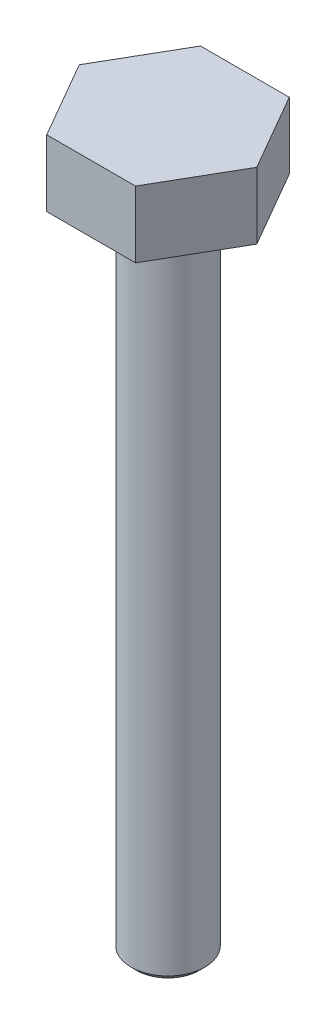
ISO-10303-21;
HEADER;
FILE_DESCRIPTION(('STEP AP214'),'2;1');
FILE_NAME('part.step','',(''),(''),'','','');
FILE_SCHEMA(('AUTOMOTIVE_DESIGN { 1 0 10303 214 1 1 1 1 }'));
ENDSEC;
DATA;
#1=APPLICATION_CONTEXT('core data for automotive mechanical design processes');
#2=APPLICATION_PROTOCOL_DEFINITION('international standard','automotive_design',2000,#1);
#3=PRODUCT_CONTEXT('',#1,'mechanical');
#4=PRODUCT('Part','Part','',(#3));
#5=PRODUCT_RELATED_PRODUCT_CATEGORY('part','',(#4));
#6=PRODUCT_DEFINITION_FORMATION('','',#4);
#7=PRODUCT_DEFINITION_CONTEXT('part definition',#1,'design');
#8=PRODUCT_DEFINITION('design','',#6,#7);
#9=PRODUCT_DEFINITION_SHAPE('','',#8);
#10=(LENGTH_UNIT() NAMED_UNIT(*) SI_UNIT(.MILLI.,.METRE.));
#11=(NAMED_UNIT(*) PLANE_ANGLE_UNIT() SI_UNIT($,.RADIAN.));
#12=(NAMED_UNIT(*) SI_UNIT($,.STERADIAN.) SOLID_ANGLE_UNIT());
#13=UNCERTAINTY_MEASURE_WITH_UNIT(LENGTH_MEASURE(1.E-05),#10,'distance_accuracy_value','');
#14=(GEOMETRIC_REPRESENTATION_CONTEXT(3) GLOBAL_UNCERTAINTY_ASSIGNED_CONTEXT((#13)) GLOBAL_UNIT_ASSIGNED_CONTEXT((#10,
#11,#12)) REPRESENTATION_CONTEXT('',''));
#15=CARTESIAN_POINT('',(0.,0.,0.));
#16=DIRECTION('',(0.,0.,1.));
#17=DIRECTION('',(1.,0.,0.));
#18=AXIS2_PLACEMENT_3D('',#15,#16,#17);
#19=CARTESIAN_POINT('',(0.,45.,0.));
#20=DIRECTION('',(0.,1.,0.));
#21=DIRECTION('',(0.,0.,1.));
#22=AXIS2_PLACEMENT_3D('',#19,#20,#21);
#23=PLANE('',#22);
#24=DIRECTION('',(0.499999999999995,0.,-0.866025403784441));
#25=VECTOR('',#24,1.);
#26=CARTESIAN_POINT('',(30.0222139978612,45.,51.9999999999997));
#27=LINE('',#26,#25);
#28=CARTESIAN_POINT('',(30.0222139978612,45.,51.9999999999997));
#29=VERTEX_POINT('',#28);
#30=CARTESIAN_POINT('',(60.0444279957211,45.,0.));
#31=VERTEX_POINT('',#30);
#32=EDGE_CURVE('E157',#29,#31,#27,.T.);
#33=ORIENTED_EDGE('',*,*,#32,.T.);
#34=DIRECTION('',(-0.500000000000001,0.,-0.866025403784438));
#35=VECTOR('',#34,1.);
#36=CARTESIAN_POINT('',(60.0444279957211,45.,0.));
#37=LINE('',#36,#35);
#38=CARTESIAN_POINT('',(30.0222139978604,45.,-52.0000000000001));
#39=VERTEX_POINT('',#38);
#40=EDGE_CURVE('E116',#31,#39,#37,.T.);
#41=ORIENTED_EDGE('',*,*,#40,.T.);
#42=DIRECTION('',(-1.,0.,0.));
#43=VECTOR('',#42,1.);
#44=CARTESIAN_POINT('',(30.0222139978604,45.,-52.0000000000001));
#45=LINE('',#44,#43);
#46=CARTESIAN_POINT('',(-30.0222139978608,45.,-51.9999999999999));
#47=VERTEX_POINT('',#46);
#48=EDGE_CURVE('E128',#39,#47,#45,.T.);
#49=ORIENTED_EDGE('',*,*,#48,.T.);
#50=DIRECTION('',(-0.499999999999995,0.,0.866025403784442));
#51=VECTOR('',#50,1.);
#52=CARTESIAN_POINT('',(-30.0222139978608,45.,-51.9999999999999));
#53=LINE('',#52,#51);
#54=CARTESIAN_POINT('',(-60.0444279957211,45.,4.19287999697141E-13));
#55=VERTEX_POINT('',#54);
#56=EDGE_CURVE('E123',#47,#55,#53,.T.);
#57=ORIENTED_EDGE('',*,*,#56,.T.);
#58=DIRECTION('',(0.500000000000007,0.,0.866025403784435));
#59=VECTOR('',#58,1.);
#60=CARTESIAN_POINT('',(-60.0444279957211,45.,4.19287999697141E-13));
#61=LINE('',#60,#59);
#62=CARTESIAN_POINT('',(-30.0222139978601,45.,52.0000000000003));
#63=VERTEX_POINT('',#62);
#64=EDGE_CURVE('E126',#55,#63,#61,.T.);
#65=ORIENTED_EDGE('',*,*,#64,.T.);
#66=DIRECTION('',(1.,0.,0.));
#67=VECTOR('',#66,1.);
#68=CARTESIAN_POINT('',(-30.0222139978601,45.,52.0000000000003));
#69=LINE('',#68,#67);
#70=EDGE_CURVE('E78',#63,#29,#69,.T.);
#71=ORIENTED_EDGE('',*,*,#70,.T.);
#72=EDGE_LOOP('',(#33,#41,#49,#57,#65,#71));
#73=FACE_BOUND('',#72,.T.);
#74=ADVANCED_FACE('F60',(#73),#23,.T.);
#75=CARTESIAN_POINT('',(0.,0.,0.));
#76=DIRECTION('',(0.,1.,0.));
#77=DIRECTION('',(0.,0.,1.));
#78=AXIS2_PLACEMENT_3D('',#75,#76,#77);
#79=PLANE('',#78);
#80=DIRECTION('',(0.499999999999995,0.,-0.866025403784441));
#81=VECTOR('',#80,1.);
#82=CARTESIAN_POINT('',(30.0222139978612,0.,51.9999999999997));
#83=LINE('',#82,#81);
#84=CARTESIAN_POINT('',(30.0222139978612,0.,51.9999999999997));
#85=VERTEX_POINT('',#84);
#86=CARTESIAN_POINT('',(60.0444279957211,0.,0.));
#87=VERTEX_POINT('',#86);
#88=EDGE_CURVE('E146',#85,#87,#83,.T.);
#89=ORIENTED_EDGE('',*,*,#88,.F.);
#90=DIRECTION('',(1.,0.,0.));
#91=VECTOR('',#90,1.);
#92=CARTESIAN_POINT('',(-30.0222139978601,0.,52.0000000000003));
#93=LINE('',#92,#91);
#94=CARTESIAN_POINT('',(-30.0222139978601,0.,52.0000000000003));
#95=VERTEX_POINT('',#94);
#96=EDGE_CURVE('E107',#95,#85,#93,.T.);
#97=ORIENTED_EDGE('',*,*,#96,.F.);
#98=DIRECTION('',(0.500000000000007,0.,0.866025403784435));
#99=VECTOR('',#98,1.);
#100=CARTESIAN_POINT('',(-60.0444279957211,0.,4.19287999697141E-13));
#101=LINE('',#100,#99);
#102=CARTESIAN_POINT('',(-60.0444279957211,0.,4.19287999697141E-13));
#103=VERTEX_POINT('',#102);
#104=EDGE_CURVE('E101',#103,#95,#101,.T.);
#105=ORIENTED_EDGE('',*,*,#104,.F.);
#106=DIRECTION('',(-0.499999999999995,0.,0.866025403784442));
#107=VECTOR('',#106,1.);
#108=CARTESIAN_POINT('',(-30.0222139978608,0.,-51.9999999999999));
#109=LINE('',#108,#107);
#110=CARTESIAN_POINT('',(-30.0222139978608,0.,-51.9999999999999));
#111=VERTEX_POINT('',#110);
#112=EDGE_CURVE('E136',#111,#103,#109,.T.);
#113=ORIENTED_EDGE('',*,*,#112,.F.);
#114=DIRECTION('',(-1.,0.,0.));
#115=VECTOR('',#114,1.);
#116=CARTESIAN_POINT('',(30.0222139978604,0.,-52.0000000000001));
#117=LINE('',#116,#115);
#118=CARTESIAN_POINT('',(30.0222139978604,0.,-52.0000000000001));
#119=VERTEX_POINT('',#118);
#120=EDGE_CURVE('E152',#119,#111,#117,.T.);
#121=ORIENTED_EDGE('',*,*,#120,.F.);
#122=DIRECTION('',(-0.500000000000001,0.,-0.866025403784438));
#123=VECTOR('',#122,1.);
#124=CARTESIAN_POINT('',(60.0444279957211,0.,0.));
#125=LINE('',#124,#123);
#126=EDGE_CURVE('E149',#87,#119,#125,.T.);
#127=ORIENTED_EDGE('',*,*,#126,.F.);
#128=EDGE_LOOP('',(#89,#97,#105,#113,#121,#127));
#129=FACE_BOUND('',#128,.T.);
#130=CARTESIAN_POINT('',(0.,0.,0.));
#131=DIRECTION('',(0.,1.,0.));
#132=DIRECTION('',(0.,0.,1.));
#133=AXIS2_PLACEMENT_3D('',#130,#131,#132);
#134=CIRCLE('',#133,25.);
#135=CARTESIAN_POINT('',(0.,0.,25.));
#136=VERTEX_POINT('',#135);
#137=EDGE_CURVE('E150',#136,#136,#134,.T.);
#138=ORIENTED_EDGE('',*,*,#137,.T.);
#139=EDGE_LOOP('',(#138));
#140=FACE_BOUND('',#139,.T.);
#141=ADVANCED_FACE('F181',(#129,#140),#79,.F.);
#142=CARTESIAN_POINT('',(30.0222139978612,45.,51.9999999999997));
#143=DIRECTION('',(-0.866025403784441,0.,-0.499999999999995));
#144=DIRECTION('',(-0.499999999999995,0.,0.866025403784442));
#145=AXIS2_PLACEMENT_3D('',#142,#143,#144);
#146=PLANE('',#145);
#147=ORIENTED_EDGE('',*,*,#88,.T.);
#148=DIRECTION('',(0.,-1.,0.));
#149=VECTOR('',#148,1.);
#150=CARTESIAN_POINT('',(60.0444279957211,45.,0.));
#151=LINE('',#150,#149);
#152=EDGE_CURVE('E164',#31,#87,#151,.T.);
#153=ORIENTED_EDGE('',*,*,#152,.F.);
#154=ORIENTED_EDGE('',*,*,#32,.F.);
#155=DIRECTION('',(0.,-1.,0.));
#156=VECTOR('',#155,1.);
#157=CARTESIAN_POINT('',(30.0222139978612,45.,51.9999999999997));
#158=LINE('',#157,#156);
#159=EDGE_CURVE('E142',#29,#85,#158,.T.);
#160=ORIENTED_EDGE('',*,*,#159,.T.);
#161=EDGE_LOOP('',(#147,#153,#154,#160));
#162=FACE_BOUND('',#161,.T.);
#163=ADVANCED_FACE('F186',(#162),#146,.F.);
#164=CARTESIAN_POINT('',(60.0444279957211,45.,0.));
#165=DIRECTION('',(-0.866025403784438,0.,0.500000000000001));
#166=DIRECTION('',(0.500000000000001,0.,0.866025403784438));
#167=AXIS2_PLACEMENT_3D('',#164,#165,#166);
#168=PLANE('',#167);
#169=ORIENTED_EDGE('',*,*,#126,.T.);
#170=DIRECTION('',(0.,-1.,0.));
#171=VECTOR('',#170,1.);
#172=CARTESIAN_POINT('',(30.0222139978604,45.,-52.0000000000001));
#173=LINE('',#172,#171);
#174=EDGE_CURVE('E161',#39,#119,#173,.T.);
#175=ORIENTED_EDGE('',*,*,#174,.F.);
#176=ORIENTED_EDGE('',*,*,#40,.F.);
#177=ORIENTED_EDGE('',*,*,#152,.T.);
#178=EDGE_LOOP('',(#169,#175,#176,#177));
#179=FACE_BOUND('',#178,.T.);
#180=ADVANCED_FACE('F201',(#179),#168,.F.);
#181=CARTESIAN_POINT('',(30.0222139978604,45.,-52.0000000000001));
#182=DIRECTION('',(0.,0.,1.));
#183=DIRECTION('',(1.,0.,0.));
#184=AXIS2_PLACEMENT_3D('',#181,#182,#183);
#185=PLANE('',#184);
#186=ORIENTED_EDGE('',*,*,#120,.T.);
#187=DIRECTION('',(0.,-1.,0.));
#188=VECTOR('',#187,1.);
#189=CARTESIAN_POINT('',(-30.0222139978608,45.,-51.9999999999999));
#190=LINE('',#189,#188);
#191=EDGE_CURVE('E137',#47,#111,#190,.T.);
#192=ORIENTED_EDGE('',*,*,#191,.F.);
#193=ORIENTED_EDGE('',*,*,#48,.F.);
#194=ORIENTED_EDGE('',*,*,#174,.T.);
#195=EDGE_LOOP('',(#186,#192,#193,#194));
#196=FACE_BOUND('',#195,.T.);
#197=ADVANCED_FACE('F198',(#196),#185,.F.);
#198=CARTESIAN_POINT('',(-30.0222139978608,45.,-51.9999999999999));
#199=DIRECTION('',(0.866025403784441,0.,0.499999999999995));
#200=DIRECTION('',(0.499999999999995,0.,-0.866025403784442));
#201=AXIS2_PLACEMENT_3D('',#198,#199,#200);
#202=PLANE('',#201);
#203=ORIENTED_EDGE('',*,*,#112,.T.);
#204=DIRECTION('',(0.,-1.,0.));
#205=VECTOR('',#204,1.);
#206=CARTESIAN_POINT('',(-60.0444279957211,45.,4.19287999697141E-13));
#207=LINE('',#206,#205);
#208=EDGE_CURVE('E133',#55,#103,#207,.T.);
#209=ORIENTED_EDGE('',*,*,#208,.F.);
#210=ORIENTED_EDGE('',*,*,#56,.F.);
#211=ORIENTED_EDGE('',*,*,#191,.T.);
#212=EDGE_LOOP('',(#203,#209,#210,#211));
#213=FACE_BOUND('',#212,.T.);
#214=ADVANCED_FACE('F134',(#213),#202,.F.);
#215=CARTESIAN_POINT('',(-60.0444279957211,45.,4.19287999697141E-13));
#216=DIRECTION('',(0.866025403784434,0.,-0.500000000000007));
#217=DIRECTION('',(-0.500000000000007,0.,-0.866025403784435));
#218=AXIS2_PLACEMENT_3D('',#215,#216,#217);
#219=PLANE('',#218);
#220=ORIENTED_EDGE('',*,*,#104,.T.);
#221=DIRECTION('',(0.,-1.,0.));
#222=VECTOR('',#221,1.);
#223=CARTESIAN_POINT('',(-30.0222139978601,45.,52.0000000000003));
#224=LINE('',#223,#222);
#225=EDGE_CURVE('E138',#63,#95,#224,.T.);
#226=ORIENTED_EDGE('',*,*,#225,.F.);
#227=ORIENTED_EDGE('',*,*,#64,.F.);
#228=ORIENTED_EDGE('',*,*,#208,.T.);
#229=EDGE_LOOP('',(#220,#226,#227,#228));
#230=FACE_BOUND('',#229,.T.);
#231=ADVANCED_FACE('F140',(#230),#219,.F.);
#232=CARTESIAN_POINT('',(-30.0222139978601,45.,52.0000000000003));
#233=DIRECTION('',(0.,0.,-1.));
#234=DIRECTION('',(-1.,0.,0.));
#235=AXIS2_PLACEMENT_3D('',#232,#233,#234);
#236=PLANE('',#235);
#237=ORIENTED_EDGE('',*,*,#96,.T.);
#238=ORIENTED_EDGE('',*,*,#159,.F.);
#239=ORIENTED_EDGE('',*,*,#70,.F.);
#240=ORIENTED_EDGE('',*,*,#225,.T.);
#241=EDGE_LOOP('',(#237,#238,#239,#240));
#242=FACE_BOUND('',#241,.T.);
#243=ADVANCED_FACE('F191',(#242),#236,.F.);
#244=CARTESIAN_POINT('',(0.,-445.,0.));
#245=DIRECTION('',(0.,1.,0.));
#246=DIRECTION('',(0.,0.,1.));
#247=AXIS2_PLACEMENT_3D('',#244,#245,#246);
#248=CYLINDRICAL_SURFACE('',#247,25.);
#249=CARTESIAN_POINT('',(0.,-441.,0.));
#250=DIRECTION('',(0.,1.,0.));
#251=DIRECTION('',(0.,0.,1.));
#252=AXIS2_PLACEMENT_3D('',#249,#250,#251);
#253=CIRCLE('',#252,25.);
#254=CARTESIAN_POINT('',(0.,-441.,25.));
#255=VERTEX_POINT('',#254);
#256=EDGE_CURVE('E70',#255,#255,#253,.T.);
#257=ORIENTED_EDGE('',*,*,#256,.T.);
#258=EDGE_LOOP('',(#257));
#259=FACE_BOUND('',#258,.T.);
#260=ORIENTED_EDGE('',*,*,#137,.F.);
#261=EDGE_LOOP('',(#260));
#262=FACE_BOUND('',#261,.T.);
#263=ADVANCED_FACE('F168',(#259,#262),#248,.T.);
#264=CARTESIAN_POINT('',(0.,-445.,0.));
#265=DIRECTION('',(0.,1.,0.));
#266=DIRECTION('',(0.,0.,1.));
#267=AXIS2_PLACEMENT_3D('',#264,#265,#266);
#268=PLANE('',#267);
#269=CARTESIAN_POINT('',(0.,-445.,0.));
#270=DIRECTION('',(0.,1.,0.));
#271=DIRECTION('',(0.,0.,1.));
#272=AXIS2_PLACEMENT_3D('',#269,#270,#271);
#273=CIRCLE('',#272,21.0000000000002);
#274=CARTESIAN_POINT('',(0.,-445.,21.0000000000002));
#275=VERTEX_POINT('',#274);
#276=EDGE_CURVE('E12',#275,#275,#273,.F.);
#277=ORIENTED_EDGE('',*,*,#276,.T.);
#278=EDGE_LOOP('',(#277));
#279=FACE_BOUND('',#278,.T.);
#280=ADVANCED_FACE('F172',(#279),#268,.F.);
#281=CARTESIAN_POINT('',(0.,-441.,0.));
#282=DIRECTION('',(0.,1.,0.));
#283=DIRECTION('',(0.,0.,1.));
#284=AXIS2_PLACEMENT_3D('',#281,#282,#283);
#285=CONICAL_SURFACE('',#284,25.,0.785398163397439);
#286=ORIENTED_EDGE('',*,*,#276,.F.);
#287=EDGE_LOOP('',(#286));
#288=FACE_BOUND('',#287,.T.);
#289=ORIENTED_EDGE('',*,*,#256,.F.);
#290=EDGE_LOOP('',(#289));
#291=FACE_BOUND('',#290,.T.);
#292=ADVANCED_FACE('F63',(#288,#291),#285,.T.);
#293=CLOSED_SHELL('',(#74,#141,#163,#180,#197,#214,#231,#243,#263,#280,#292));
#294=MANIFOLD_SOLID_BREP('B2',#293);
#295=ADVANCED_BREP_SHAPE_REPRESENTATION('',(#18,#294),#14);
#296=SHAPE_DEFINITION_REPRESENTATION(#9,#295);
ENDSEC;
END-ISO-10303-21;
